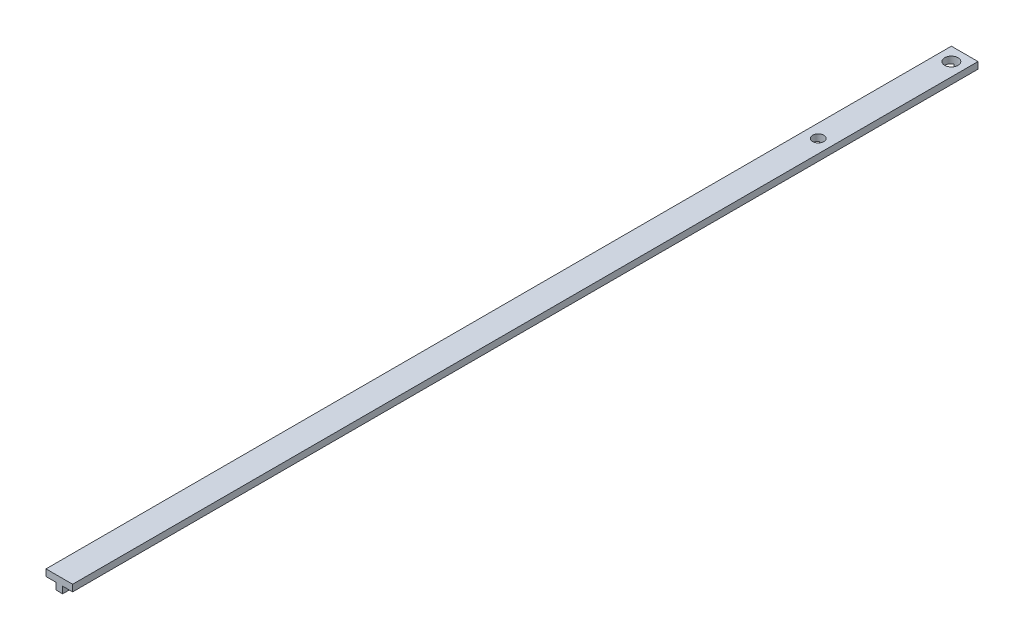
ISO-10303-21;
HEADER;
FILE_DESCRIPTION(('STEP AP214'),'2;1');
FILE_NAME('part.step','',(''),(''),'','','');
FILE_SCHEMA(('AUTOMOTIVE_DESIGN { 1 0 10303 214 1 1 1 1 }'));
ENDSEC;
DATA;
#1=APPLICATION_CONTEXT('core data for automotive mechanical design processes');
#2=APPLICATION_PROTOCOL_DEFINITION('international standard','automotive_design',2000,#1);
#3=PRODUCT_CONTEXT('',#1,'mechanical');
#4=PRODUCT('Part','Part','',(#3));
#5=PRODUCT_RELATED_PRODUCT_CATEGORY('part','',(#4));
#6=PRODUCT_DEFINITION_FORMATION('','',#4);
#7=PRODUCT_DEFINITION_CONTEXT('part definition',#1,'design');
#8=PRODUCT_DEFINITION('design','',#6,#7);
#9=PRODUCT_DEFINITION_SHAPE('','',#8);
#10=(LENGTH_UNIT() NAMED_UNIT(*) SI_UNIT(.MILLI.,.METRE.));
#11=(NAMED_UNIT(*) PLANE_ANGLE_UNIT() SI_UNIT($,.RADIAN.));
#12=(NAMED_UNIT(*) SI_UNIT($,.STERADIAN.) SOLID_ANGLE_UNIT());
#13=UNCERTAINTY_MEASURE_WITH_UNIT(LENGTH_MEASURE(1.E-05),#10,'distance_accuracy_value','');
#14=(GEOMETRIC_REPRESENTATION_CONTEXT(3) GLOBAL_UNCERTAINTY_ASSIGNED_CONTEXT((#13)) GLOBAL_UNIT_ASSIGNED_CONTEXT((#10,
#11,#12)) REPRESENTATION_CONTEXT('',''));
#15=CARTESIAN_POINT('',(0.,0.,0.));
#16=DIRECTION('',(0.,0.,1.));
#17=DIRECTION('',(1.,0.,0.));
#18=AXIS2_PLACEMENT_3D('',#15,#16,#17);
#19=CARTESIAN_POINT('',(-1.5875,-3.175,-215.9));
#20=DIRECTION('',(1.,0.,0.));
#21=DIRECTION('',(0.,1.,0.));
#22=AXIS2_PLACEMENT_3D('',#19,#20,#21);
#23=PLANE('',#22);
#24=DIRECTION('',(0.,0.,1.));
#25=VECTOR('',#24,1.);
#26=CARTESIAN_POINT('',(-1.5875,-3.175,-215.9));
#27=LINE('',#26,#25);
#28=CARTESIAN_POINT('',(-1.58750000000001,-3.175,-206.800369342984));
#29=VERTEX_POINT('',#28);
#30=CARTESIAN_POINT('',(-1.5875,-3.175,-148.19017375741));
#31=VERTEX_POINT('',#30);
#32=EDGE_CURVE('E160',#29,#31,#27,.T.);
#33=ORIENTED_EDGE('',*,*,#32,.T.);
#34=DIRECTION('',(0.,1.,0.));
#35=VECTOR('',#34,1.);
#36=CARTESIAN_POINT('',(-1.5875,-3.175,-148.19017375741));
#37=LINE('',#36,#35);
#38=CARTESIAN_POINT('',(-1.5875,0.,-148.19017375741));
#39=VERTEX_POINT('',#38);
#40=EDGE_CURVE('E167',#39,#31,#37,.F.);
#41=ORIENTED_EDGE('',*,*,#40,.F.);
#42=DIRECTION('',(0.,0.,1.));
#43=VECTOR('',#42,1.);
#44=CARTESIAN_POINT('',(-1.5875,0.,-215.9));
#45=LINE('',#44,#43);
#46=CARTESIAN_POINT('',(-1.5875,0.,-206.800369342984));
#47=VERTEX_POINT('',#46);
#48=EDGE_CURVE('E189',#47,#39,#45,.T.);
#49=ORIENTED_EDGE('',*,*,#48,.F.);
#50=DIRECTION('',(0.,1.,0.));
#51=VECTOR('',#50,1.);
#52=CARTESIAN_POINT('',(-1.5875,-3.175,-206.800369342984));
#53=LINE('',#52,#51);
#54=EDGE_CURVE('E178',#29,#47,#53,.T.);
#55=ORIENTED_EDGE('',*,*,#54,.F.);
#56=EDGE_LOOP('',(#33,#41,#49,#55));
#57=FACE_BOUND('',#56,.T.);
#58=ADVANCED_FACE('F41',(#57),#23,.F.);
#59=CARTESIAN_POINT('',(-1.5875,-3.175,-143.90982624259));
#60=VERTEX_POINT('',#59);
#61=CARTESIAN_POINT('',(-1.5875,-3.175,215.9));
#62=VERTEX_POINT('',#61);
#63=EDGE_CURVE('E180',#60,#62,#27,.T.);
#64=ORIENTED_EDGE('',*,*,#63,.T.);
#65=DIRECTION('',(0.,-1.,0.));
#66=VECTOR('',#65,1.);
#67=CARTESIAN_POINT('',(-1.5875,-3.175,215.9));
#68=LINE('',#67,#66);
#69=CARTESIAN_POINT('',(-1.5875,0.,215.9));
#70=VERTEX_POINT('',#69);
#71=EDGE_CURVE('E202',#70,#62,#68,.T.);
#72=ORIENTED_EDGE('',*,*,#71,.F.);
#73=CARTESIAN_POINT('',(-1.5875,0.,-143.90982624259));
#74=VERTEX_POINT('',#73);
#75=EDGE_CURVE('E183',#74,#70,#45,.T.);
#76=ORIENTED_EDGE('',*,*,#75,.F.);
#77=DIRECTION('',(0.,1.,0.));
#78=VECTOR('',#77,1.);
#79=CARTESIAN_POINT('',(-1.5875,-3.175,-143.90982624259));
#80=LINE('',#79,#78);
#81=EDGE_CURVE('E270',#60,#74,#80,.T.);
#82=ORIENTED_EDGE('',*,*,#81,.F.);
#83=EDGE_LOOP('',(#64,#72,#76,#82));
#84=FACE_BOUND('',#83,.T.);
#85=ADVANCED_FACE('F203',(#84),#23,.F.);
#86=CARTESIAN_POINT('',(1.5875,-3.175,-215.9));
#87=DIRECTION('',(0.,1.,0.));
#88=DIRECTION('',(0.,0.,-1.));
#89=AXIS2_PLACEMENT_3D('',#86,#87,#88);
#90=PLANE('',#89);
#91=DIRECTION('',(0.,0.,1.));
#92=VECTOR('',#91,1.);
#93=CARTESIAN_POINT('',(1.5875,-3.175,-215.9));
#94=LINE('',#93,#92);
#95=CARTESIAN_POINT('',(1.5875,-3.175,-206.800369342984));
#96=VERTEX_POINT('',#95);
#97=CARTESIAN_POINT('',(1.5875,-3.175,-148.19017375741));
#98=VERTEX_POINT('',#97);
#99=EDGE_CURVE('E162',#96,#98,#94,.T.);
#100=ORIENTED_EDGE('',*,*,#99,.T.);
#101=CARTESIAN_POINT('',(0.,-3.175,-146.05));
#102=DIRECTION('',(0.,-1.,0.));
#103=DIRECTION('',(-1.,0.,0.));
#104=AXIS2_PLACEMENT_3D('',#101,#102,#103);
#105=CIRCLE('',#104,2.66467633342349);
#106=EDGE_CURVE('E155',#31,#98,#105,.T.);
#107=ORIENTED_EDGE('',*,*,#106,.F.);
#108=ORIENTED_EDGE('',*,*,#32,.F.);
#109=CARTESIAN_POINT('',(0.,-3.175,-209.55));
#110=DIRECTION('',(0.,-1.,0.));
#111=DIRECTION('',(-1.,0.,0.));
#112=AXIS2_PLACEMENT_3D('',#109,#110,#111);
#113=CIRCLE('',#112,3.175);
#114=EDGE_CURVE('E311',#96,#29,#113,.T.);
#115=ORIENTED_EDGE('',*,*,#114,.F.);
#116=EDGE_LOOP('',(#100,#107,#108,#115));
#117=FACE_BOUND('',#116,.T.);
#118=ADVANCED_FACE('F157',(#117),#90,.F.);
#119=CARTESIAN_POINT('',(1.5875,-3.175,-143.90982624259));
#120=VERTEX_POINT('',#119);
#121=CARTESIAN_POINT('',(1.5875,-3.175,215.9));
#122=VERTEX_POINT('',#121);
#123=EDGE_CURVE('E238',#120,#122,#94,.T.);
#124=ORIENTED_EDGE('',*,*,#123,.T.);
#125=DIRECTION('',(1.,0.,0.));
#126=VECTOR('',#125,1.);
#127=CARTESIAN_POINT('',(1.5875,-3.175,215.9));
#128=LINE('',#127,#126);
#129=EDGE_CURVE('E207',#62,#122,#128,.T.);
#130=ORIENTED_EDGE('',*,*,#129,.F.);
#131=ORIENTED_EDGE('',*,*,#63,.F.);
#132=EDGE_CURVE('E164',#120,#60,#105,.T.);
#133=ORIENTED_EDGE('',*,*,#132,.F.);
#134=EDGE_LOOP('',(#124,#130,#131,#133));
#135=FACE_BOUND('',#134,.T.);
#136=ADVANCED_FACE('F261',(#135),#90,.F.);
#137=CARTESIAN_POINT('',(1.5875,0.,-215.9));
#138=DIRECTION('',(-1.,0.,0.));
#139=DIRECTION('',(0.,-1.,0.));
#140=AXIS2_PLACEMENT_3D('',#137,#138,#139);
#141=PLANE('',#140);
#142=CARTESIAN_POINT('',(1.5875,-3.175,-215.9));
#143=VERTEX_POINT('',#142);
#144=CARTESIAN_POINT('',(1.5875,-3.175,-212.299630657016));
#145=VERTEX_POINT('',#144);
#146=EDGE_CURVE('E185',#143,#145,#94,.T.);
#147=ORIENTED_EDGE('',*,*,#146,.F.);
#148=DIRECTION('',(0.,1.,0.));
#149=VECTOR('',#148,1.);
#150=CARTESIAN_POINT('',(1.5875,0.,-215.9));
#151=LINE('',#150,#149);
#152=CARTESIAN_POINT('',(1.5875,0.,-215.9));
#153=VERTEX_POINT('',#152);
#154=EDGE_CURVE('E293',#143,#153,#151,.T.);
#155=ORIENTED_EDGE('',*,*,#154,.T.);
#156=DIRECTION('',(0.,0.,1.));
#157=VECTOR('',#156,1.);
#158=CARTESIAN_POINT('',(1.5875,0.,-215.9));
#159=LINE('',#158,#157);
#160=CARTESIAN_POINT('',(1.5875,0.,-212.299630657016));
#161=VERTEX_POINT('',#160);
#162=EDGE_CURVE('E236',#153,#161,#159,.T.);
#163=ORIENTED_EDGE('',*,*,#162,.T.);
#164=DIRECTION('',(0.,1.,0.));
#165=VECTOR('',#164,1.);
#166=CARTESIAN_POINT('',(1.5875,-3.175,-212.299630657016));
#167=LINE('',#166,#165);
#168=EDGE_CURVE('E275',#145,#161,#167,.T.);
#169=ORIENTED_EDGE('',*,*,#168,.F.);
#170=EDGE_LOOP('',(#147,#155,#163,#169));
#171=FACE_BOUND('',#170,.T.);
#172=ADVANCED_FACE('F353',(#171),#141,.F.);
#173=CARTESIAN_POINT('',(1.5875,0.,-206.800369342984));
#174=VERTEX_POINT('',#173);
#175=CARTESIAN_POINT('',(1.5875,0.,-148.19017375741));
#176=VERTEX_POINT('',#175);
#177=EDGE_CURVE('E239',#174,#176,#159,.T.);
#178=ORIENTED_EDGE('',*,*,#177,.T.);
#179=DIRECTION('',(0.,1.,0.));
#180=VECTOR('',#179,1.);
#181=CARTESIAN_POINT('',(1.5875,-3.175,-148.19017375741));
#182=LINE('',#181,#180);
#183=EDGE_CURVE('E174',#98,#176,#182,.T.);
#184=ORIENTED_EDGE('',*,*,#183,.F.);
#185=ORIENTED_EDGE('',*,*,#99,.F.);
#186=DIRECTION('',(0.,1.,0.));
#187=VECTOR('',#186,1.);
#188=CARTESIAN_POINT('',(1.5875,-3.175,-206.800369342984));
#189=LINE('',#188,#187);
#190=EDGE_CURVE('E273',#174,#96,#189,.F.);
#191=ORIENTED_EDGE('',*,*,#190,.F.);
#192=EDGE_LOOP('',(#178,#184,#185,#191));
#193=FACE_BOUND('',#192,.T.);
#194=ADVANCED_FACE('F349',(#193),#141,.F.);
#195=CARTESIAN_POINT('',(-6.35,0.,-215.9));
#196=DIRECTION('',(1.,0.,0.));
#197=DIRECTION('',(0.,1.,0.));
#198=AXIS2_PLACEMENT_3D('',#195,#196,#197);
#199=PLANE('',#198);
#200=DIRECTION('',(0.,-1.,0.));
#201=VECTOR('',#200,1.);
#202=CARTESIAN_POINT('',(-6.35,0.,215.9));
#203=LINE('',#202,#201);
#204=CARTESIAN_POINT('',(-6.35,3.175,215.9));
#205=VERTEX_POINT('',#204);
#206=CARTESIAN_POINT('',(-6.35,0.,215.9));
#207=VERTEX_POINT('',#206);
#208=EDGE_CURVE('E211',#205,#207,#203,.T.);
#209=ORIENTED_EDGE('',*,*,#208,.F.);
#210=DIRECTION('',(0.,0.,1.));
#211=VECTOR('',#210,1.);
#212=CARTESIAN_POINT('',(-6.35,3.175,-215.9));
#213=LINE('',#212,#211);
#214=CARTESIAN_POINT('',(-6.35,3.175,-215.9));
#215=VERTEX_POINT('',#214);
#216=EDGE_CURVE('E226',#215,#205,#213,.T.);
#217=ORIENTED_EDGE('',*,*,#216,.F.);
#218=DIRECTION('',(0.,-1.,0.));
#219=VECTOR('',#218,1.);
#220=CARTESIAN_POINT('',(-6.35,0.,-215.9));
#221=LINE('',#220,#219);
#222=CARTESIAN_POINT('',(-6.35,0.,-215.9));
#223=VERTEX_POINT('',#222);
#224=EDGE_CURVE('E225',#215,#223,#221,.T.);
#225=ORIENTED_EDGE('',*,*,#224,.T.);
#226=DIRECTION('',(0.,0.,1.));
#227=VECTOR('',#226,1.);
#228=CARTESIAN_POINT('',(-6.35,0.,-215.9));
#229=LINE('',#228,#227);
#230=EDGE_CURVE('E11',#223,#207,#229,.T.);
#231=ORIENTED_EDGE('',*,*,#230,.T.);
#232=EDGE_LOOP('',(#209,#217,#225,#231));
#233=FACE_BOUND('',#232,.T.);
#234=ADVANCED_FACE('F43',(#233),#199,.F.);
#235=CARTESIAN_POINT('',(-1.5875,0.,-215.9));
#236=DIRECTION('',(0.,1.,0.));
#237=DIRECTION('',(-1.,0.,0.));
#238=AXIS2_PLACEMENT_3D('',#235,#236,#237);
#239=PLANE('',#238);
#240=ORIENTED_EDGE('',*,*,#48,.T.);
#241=CARTESIAN_POINT('',(0.,0.,-146.05));
#242=DIRECTION('',(0.,-1.,0.));
#243=DIRECTION('',(-1.,0.,0.));
#244=AXIS2_PLACEMENT_3D('',#241,#242,#243);
#245=CIRCLE('',#244,2.66467633342349);
#246=EDGE_CURVE('E170',#74,#39,#245,.T.);
#247=ORIENTED_EDGE('',*,*,#246,.F.);
#248=ORIENTED_EDGE('',*,*,#75,.T.);
#249=DIRECTION('',(1.,0.,0.));
#250=VECTOR('',#249,1.);
#251=CARTESIAN_POINT('',(-1.5875,0.,215.9));
#252=LINE('',#251,#250);
#253=EDGE_CURVE('E198',#207,#70,#252,.T.);
#254=ORIENTED_EDGE('',*,*,#253,.F.);
#255=ORIENTED_EDGE('',*,*,#230,.F.);
#256=DIRECTION('',(1.,0.,0.));
#257=VECTOR('',#256,1.);
#258=CARTESIAN_POINT('',(-1.5875,0.,-215.9));
#259=LINE('',#258,#257);
#260=CARTESIAN_POINT('',(-1.5875,0.,-215.9));
#261=VERTEX_POINT('',#260);
#262=EDGE_CURVE('E286',#223,#261,#259,.T.);
#263=ORIENTED_EDGE('',*,*,#262,.T.);
#264=CARTESIAN_POINT('',(-1.5875,0.,-212.299630657016));
#265=VERTEX_POINT('',#264);
#266=EDGE_CURVE('E49',#261,#265,#45,.T.);
#267=ORIENTED_EDGE('',*,*,#266,.T.);
#268=CARTESIAN_POINT('',(0.,0.,-209.55));
#269=DIRECTION('',(0.,-1.,0.));
#270=DIRECTION('',(-1.,0.,0.));
#271=AXIS2_PLACEMENT_3D('',#268,#269,#270);
#272=CIRCLE('',#271,3.175);
#273=EDGE_CURVE('E280',#47,#265,#272,.T.);
#274=ORIENTED_EDGE('',*,*,#273,.F.);
#275=EDGE_LOOP('',(#240,#247,#248,#254,#255,#263,#267,#274));
#276=FACE_BOUND('',#275,.T.);
#277=ADVANCED_FACE('F196',(#276),#239,.F.);
#278=ORIENTED_EDGE('',*,*,#266,.F.);
#279=DIRECTION('',(0.,-1.,0.));
#280=VECTOR('',#279,1.);
#281=CARTESIAN_POINT('',(-1.5875,-3.175,-215.9));
#282=LINE('',#281,#280);
#283=CARTESIAN_POINT('',(-1.5875,-3.175,-215.9));
#284=VERTEX_POINT('',#283);
#285=EDGE_CURVE('E288',#261,#284,#282,.T.);
#286=ORIENTED_EDGE('',*,*,#285,.T.);
#287=CARTESIAN_POINT('',(-1.58750000000001,-3.175,-212.299630657016));
#288=VERTEX_POINT('',#287);
#289=EDGE_CURVE('E179',#284,#288,#27,.T.);
#290=ORIENTED_EDGE('',*,*,#289,.T.);
#291=DIRECTION('',(0.,1.,0.));
#292=VECTOR('',#291,1.);
#293=CARTESIAN_POINT('',(-1.5875,-3.175,-212.299630657016));
#294=LINE('',#293,#292);
#295=EDGE_CURVE('E277',#265,#288,#294,.F.);
#296=ORIENTED_EDGE('',*,*,#295,.F.);
#297=EDGE_LOOP('',(#278,#286,#290,#296));
#298=FACE_BOUND('',#297,.T.);
#299=ADVANCED_FACE('F309',(#298),#23,.F.);
#300=ORIENTED_EDGE('',*,*,#289,.F.);
#301=DIRECTION('',(1.,0.,0.));
#302=VECTOR('',#301,1.);
#303=CARTESIAN_POINT('',(1.5875,-3.175,-215.9));
#304=LINE('',#303,#302);
#305=EDGE_CURVE('E291',#284,#143,#304,.T.);
#306=ORIENTED_EDGE('',*,*,#305,.T.);
#307=ORIENTED_EDGE('',*,*,#146,.T.);
#308=EDGE_CURVE('E266',#288,#145,#113,.T.);
#309=ORIENTED_EDGE('',*,*,#308,.F.);
#310=EDGE_LOOP('',(#300,#306,#307,#309));
#311=FACE_BOUND('',#310,.T.);
#312=ADVANCED_FACE('F340',(#311),#90,.F.);
#313=CARTESIAN_POINT('',(1.5875,0.,-143.90982624259));
#314=VERTEX_POINT('',#313);
#315=CARTESIAN_POINT('',(1.5875,0.,215.9));
#316=VERTEX_POINT('',#315);
#317=EDGE_CURVE('E235',#314,#316,#159,.T.);
#318=ORIENTED_EDGE('',*,*,#317,.T.);
#319=DIRECTION('',(0.,1.,0.));
#320=VECTOR('',#319,1.);
#321=CARTESIAN_POINT('',(1.5875,0.,215.9));
#322=LINE('',#321,#320);
#323=EDGE_CURVE('E209',#122,#316,#322,.T.);
#324=ORIENTED_EDGE('',*,*,#323,.F.);
#325=ORIENTED_EDGE('',*,*,#123,.F.);
#326=DIRECTION('',(0.,1.,0.));
#327=VECTOR('',#326,1.);
#328=CARTESIAN_POINT('',(1.5875,-3.175,-143.90982624259));
#329=LINE('',#328,#327);
#330=EDGE_CURVE('E251',#314,#120,#329,.F.);
#331=ORIENTED_EDGE('',*,*,#330,.F.);
#332=EDGE_LOOP('',(#318,#324,#325,#331));
#333=FACE_BOUND('',#332,.T.);
#334=ADVANCED_FACE('F249',(#333),#141,.F.);
#335=CARTESIAN_POINT('',(6.35,0.,-215.9));
#336=DIRECTION('',(0.,1.,0.));
#337=DIRECTION('',(-1.,0.,0.));
#338=AXIS2_PLACEMENT_3D('',#335,#336,#337);
#339=PLANE('',#338);
#340=ORIENTED_EDGE('',*,*,#162,.F.);
#341=DIRECTION('',(1.,0.,0.));
#342=VECTOR('',#341,1.);
#343=CARTESIAN_POINT('',(6.35,0.,-215.9));
#344=LINE('',#343,#342);
#345=CARTESIAN_POINT('',(6.35,0.,-215.9));
#346=VERTEX_POINT('',#345);
#347=EDGE_CURVE('E295',#153,#346,#344,.T.);
#348=ORIENTED_EDGE('',*,*,#347,.T.);
#349=DIRECTION('',(0.,0.,1.));
#350=VECTOR('',#349,1.);
#351=CARTESIAN_POINT('',(6.35,0.,-215.9));
#352=LINE('',#351,#350);
#353=CARTESIAN_POINT('',(6.35,0.,215.9));
#354=VERTEX_POINT('',#353);
#355=EDGE_CURVE('E233',#346,#354,#352,.T.);
#356=ORIENTED_EDGE('',*,*,#355,.T.);
#357=DIRECTION('',(1.,0.,0.));
#358=VECTOR('',#357,1.);
#359=CARTESIAN_POINT('',(6.35,0.,215.9));
#360=LINE('',#359,#358);
#361=EDGE_CURVE('E217',#316,#354,#360,.T.);
#362=ORIENTED_EDGE('',*,*,#361,.F.);
#363=ORIENTED_EDGE('',*,*,#317,.F.);
#364=CARTESIAN_POINT('',(0.,0.,-146.05));
#365=DIRECTION('',(0.,-1.,0.));
#366=DIRECTION('',(-1.,0.,0.));
#367=AXIS2_PLACEMENT_3D('',#364,#365,#366);
#368=CIRCLE('',#367,2.66467633342349);
#369=EDGE_CURVE('E56',#176,#314,#368,.T.);
#370=ORIENTED_EDGE('',*,*,#369,.F.);
#371=ORIENTED_EDGE('',*,*,#177,.F.);
#372=CARTESIAN_POINT('',(0.,0.,-209.55));
#373=DIRECTION('',(0.,-1.,0.));
#374=DIRECTION('',(-1.,0.,0.));
#375=AXIS2_PLACEMENT_3D('',#372,#373,#374);
#376=CIRCLE('',#375,3.175);
#377=EDGE_CURVE('E64',#161,#174,#376,.T.);
#378=ORIENTED_EDGE('',*,*,#377,.F.);
#379=EDGE_LOOP('',(#340,#348,#356,#362,#363,#370,#371,#378));
#380=FACE_BOUND('',#379,.T.);
#381=ADVANCED_FACE('F253',(#380),#339,.F.);
#382=CARTESIAN_POINT('',(6.35,3.175,-215.9));
#383=DIRECTION('',(-1.,0.,0.));
#384=DIRECTION('',(0.,-1.,0.));
#385=AXIS2_PLACEMENT_3D('',#382,#383,#384);
#386=PLANE('',#385);
#387=DIRECTION('',(0.,1.,0.));
#388=VECTOR('',#387,1.);
#389=CARTESIAN_POINT('',(6.35,3.175,215.9));
#390=LINE('',#389,#388);
#391=CARTESIAN_POINT('',(6.35,3.175,215.9));
#392=VERTEX_POINT('',#391);
#393=EDGE_CURVE('E220',#354,#392,#390,.T.);
#394=ORIENTED_EDGE('',*,*,#393,.F.);
#395=ORIENTED_EDGE('',*,*,#355,.F.);
#396=DIRECTION('',(0.,1.,0.));
#397=VECTOR('',#396,1.);
#398=CARTESIAN_POINT('',(6.35,3.175,-215.9));
#399=LINE('',#398,#397);
#400=CARTESIAN_POINT('',(6.35,3.175,-215.9));
#401=VERTEX_POINT('',#400);
#402=EDGE_CURVE('E297',#346,#401,#399,.T.);
#403=ORIENTED_EDGE('',*,*,#402,.T.);
#404=DIRECTION('',(0.,0.,1.));
#405=VECTOR('',#404,1.);
#406=CARTESIAN_POINT('',(6.35,3.175,-215.9));
#407=LINE('',#406,#405);
#408=EDGE_CURVE('E229',#401,#392,#407,.T.);
#409=ORIENTED_EDGE('',*,*,#408,.T.);
#410=EDGE_LOOP('',(#394,#395,#403,#409));
#411=FACE_BOUND('',#410,.T.);
#412=ADVANCED_FACE('F364',(#411),#386,.F.);
#413=CARTESIAN_POINT('',(-6.35,3.175,-215.9));
#414=DIRECTION('',(0.,-1.,0.));
#415=DIRECTION('',(1.,0.,0.));
#416=AXIS2_PLACEMENT_3D('',#413,#414,#415);
#417=PLANE('',#416);
#418=CARTESIAN_POINT('',(0.,3.175,-209.55));
#419=DIRECTION('',(0.,-1.,0.));
#420=DIRECTION('',(-1.,0.,0.));
#421=AXIS2_PLACEMENT_3D('',#418,#419,#420);
#422=CIRCLE('',#421,3.175);
#423=CARTESIAN_POINT('',(-3.175,3.175,-209.55));
#424=VERTEX_POINT('',#423);
#425=EDGE_CURVE('E312',#424,#424,#422,.T.);
#426=ORIENTED_EDGE('',*,*,#425,.T.);
#427=EDGE_LOOP('',(#426));
#428=FACE_BOUND('',#427,.T.);
#429=CARTESIAN_POINT('',(0.,3.175,-146.05));
#430=DIRECTION('',(0.,-1.,0.));
#431=DIRECTION('',(-1.,0.,0.));
#432=AXIS2_PLACEMENT_3D('',#429,#430,#431);
#433=CIRCLE('',#432,2.66467633342349);
#434=CARTESIAN_POINT('',(-2.66467633342349,3.175,-146.05));
#435=VERTEX_POINT('',#434);
#436=EDGE_CURVE('E163',#435,#435,#433,.T.);
#437=ORIENTED_EDGE('',*,*,#436,.T.);
#438=EDGE_LOOP('',(#437));
#439=FACE_BOUND('',#438,.T.);
#440=DIRECTION('',(-1.,0.,0.));
#441=VECTOR('',#440,1.);
#442=CARTESIAN_POINT('',(-6.35,3.175,215.9));
#443=LINE('',#442,#441);
#444=EDGE_CURVE('E223',#392,#205,#443,.T.);
#445=ORIENTED_EDGE('',*,*,#444,.F.);
#446=ORIENTED_EDGE('',*,*,#408,.F.);
#447=DIRECTION('',(-1.,0.,0.));
#448=VECTOR('',#447,1.);
#449=CARTESIAN_POINT('',(-6.35,3.175,-215.9));
#450=LINE('',#449,#448);
#451=EDGE_CURVE('E230',#401,#215,#450,.T.);
#452=ORIENTED_EDGE('',*,*,#451,.T.);
#453=ORIENTED_EDGE('',*,*,#216,.T.);
#454=EDGE_LOOP('',(#445,#446,#452,#453));
#455=FACE_BOUND('',#454,.T.);
#456=ADVANCED_FACE('F320',(#428,#439,#455),#417,.F.);
#457=CARTESIAN_POINT('',(0.,0.,-215.9));
#458=DIRECTION('',(0.,0.,1.));
#459=DIRECTION('',(-1.,0.,0.));
#460=AXIS2_PLACEMENT_3D('',#457,#458,#459);
#461=PLANE('',#460);
#462=ORIENTED_EDGE('',*,*,#224,.F.);
#463=ORIENTED_EDGE('',*,*,#451,.F.);
#464=ORIENTED_EDGE('',*,*,#402,.F.);
#465=ORIENTED_EDGE('',*,*,#347,.F.);
#466=ORIENTED_EDGE('',*,*,#154,.F.);
#467=ORIENTED_EDGE('',*,*,#305,.F.);
#468=ORIENTED_EDGE('',*,*,#285,.F.);
#469=ORIENTED_EDGE('',*,*,#262,.F.);
#470=EDGE_LOOP('',(#462,#463,#464,#465,#466,#467,#468,#469));
#471=FACE_BOUND('',#470,.T.);
#472=ADVANCED_FACE('F305',(#471),#461,.F.);
#473=CARTESIAN_POINT('',(0.,0.,215.9));
#474=DIRECTION('',(0.,0.,1.));
#475=DIRECTION('',(-1.,0.,0.));
#476=AXIS2_PLACEMENT_3D('',#473,#474,#475);
#477=PLANE('',#476);
#478=ORIENTED_EDGE('',*,*,#208,.T.);
#479=ORIENTED_EDGE('',*,*,#253,.T.);
#480=ORIENTED_EDGE('',*,*,#71,.T.);
#481=ORIENTED_EDGE('',*,*,#129,.T.);
#482=ORIENTED_EDGE('',*,*,#323,.T.);
#483=ORIENTED_EDGE('',*,*,#361,.T.);
#484=ORIENTED_EDGE('',*,*,#393,.T.);
#485=ORIENTED_EDGE('',*,*,#444,.T.);
#486=EDGE_LOOP('',(#478,#479,#480,#481,#482,#483,#484,#485));
#487=FACE_BOUND('',#486,.T.);
#488=ADVANCED_FACE('F258',(#487),#477,.T.);
#489=CARTESIAN_POINT('',(0.,-3.175,-146.05));
#490=DIRECTION('',(0.,1.,0.));
#491=DIRECTION('',(-1.,0.,0.));
#492=AXIS2_PLACEMENT_3D('',#489,#490,#491);
#493=CYLINDRICAL_SURFACE('',#492,2.66467633342349);
#494=ORIENTED_EDGE('',*,*,#436,.F.);
#495=EDGE_LOOP('',(#494));
#496=FACE_BOUND('',#495,.T.);
#497=ORIENTED_EDGE('',*,*,#132,.T.);
#498=ORIENTED_EDGE('',*,*,#81,.T.);
#499=ORIENTED_EDGE('',*,*,#246,.T.);
#500=ORIENTED_EDGE('',*,*,#40,.T.);
#501=ORIENTED_EDGE('',*,*,#106,.T.);
#502=ORIENTED_EDGE('',*,*,#183,.T.);
#503=ORIENTED_EDGE('',*,*,#369,.T.);
#504=ORIENTED_EDGE('',*,*,#330,.T.);
#505=EDGE_LOOP('',(#497,#498,#499,#500,#501,#502,#503,#504));
#506=FACE_BOUND('',#505,.T.);
#507=ADVANCED_FACE('F168',(#496,#506),#493,.F.);
#508=CARTESIAN_POINT('',(0.,-3.175,-209.55));
#509=DIRECTION('',(0.,1.,0.));
#510=DIRECTION('',(-1.,0.,0.));
#511=AXIS2_PLACEMENT_3D('',#508,#509,#510);
#512=CYLINDRICAL_SURFACE('',#511,3.175);
#513=ORIENTED_EDGE('',*,*,#425,.F.);
#514=EDGE_LOOP('',(#513));
#515=FACE_BOUND('',#514,.T.);
#516=ORIENTED_EDGE('',*,*,#114,.T.);
#517=ORIENTED_EDGE('',*,*,#54,.T.);
#518=ORIENTED_EDGE('',*,*,#273,.T.);
#519=ORIENTED_EDGE('',*,*,#295,.T.);
#520=ORIENTED_EDGE('',*,*,#308,.T.);
#521=ORIENTED_EDGE('',*,*,#168,.T.);
#522=ORIENTED_EDGE('',*,*,#377,.T.);
#523=ORIENTED_EDGE('',*,*,#190,.T.);
#524=EDGE_LOOP('',(#516,#517,#518,#519,#520,#521,#522,#523));
#525=FACE_BOUND('',#524,.T.);
#526=ADVANCED_FACE('F310',(#515,#525),#512,.F.);
#527=CLOSED_SHELL('',(#58,#85,#118,#136,#172,#194,#234,#277,#299,#312,#334,#381,#412,#456,#472,
#488,#507,#526));
#528=MANIFOLD_SOLID_BREP('B2',#527);
#529=ADVANCED_BREP_SHAPE_REPRESENTATION('',(#18,#528),#14);
#530=SHAPE_DEFINITION_REPRESENTATION(#9,#529);
ENDSEC;
END-ISO-10303-21;
